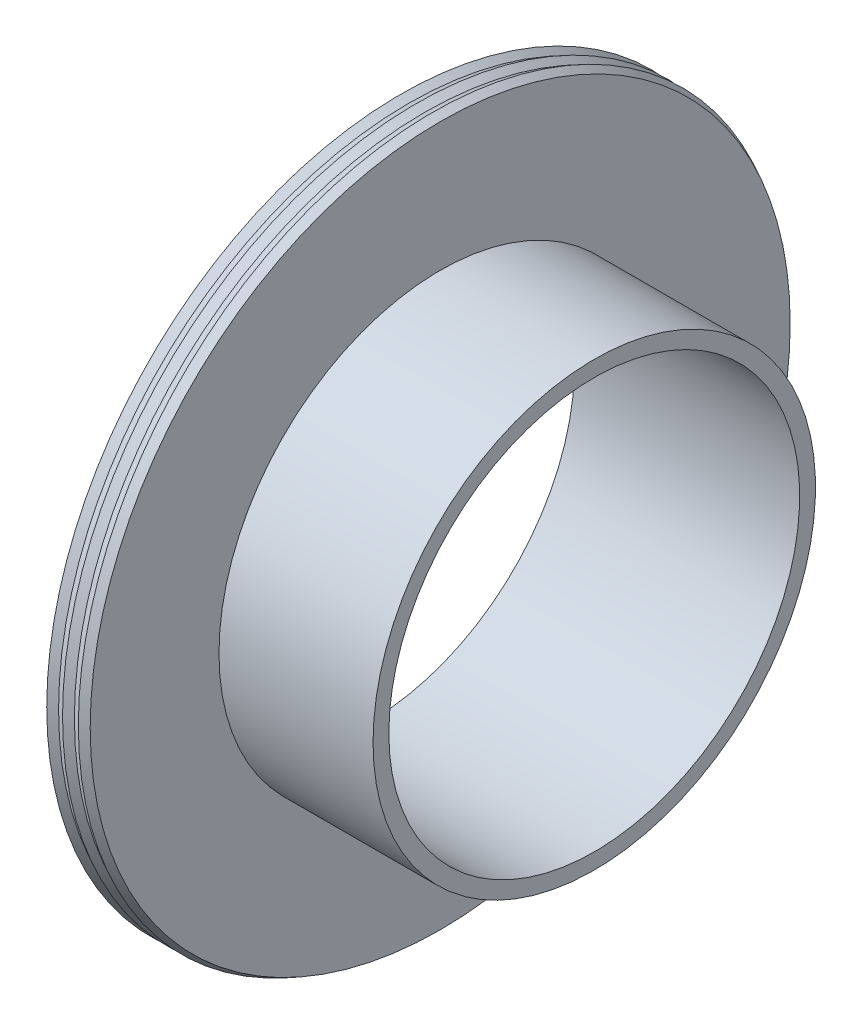
ISO-10303-21;
HEADER;
FILE_DESCRIPTION(('STEP AP214'),'2;1');
FILE_NAME('part.step','',(''),(''),'','','');
FILE_SCHEMA(('AUTOMOTIVE_DESIGN { 1 0 10303 214 1 1 1 1 }'));
ENDSEC;
DATA;
#1=APPLICATION_CONTEXT('core data for automotive mechanical design processes');
#2=APPLICATION_PROTOCOL_DEFINITION('international standard','automotive_design',2000,#1);
#3=PRODUCT_CONTEXT('',#1,'mechanical');
#4=PRODUCT('Part','Part','',(#3));
#5=PRODUCT_RELATED_PRODUCT_CATEGORY('part','',(#4));
#6=PRODUCT_DEFINITION_FORMATION('','',#4);
#7=PRODUCT_DEFINITION_CONTEXT('part definition',#1,'design');
#8=PRODUCT_DEFINITION('design','',#6,#7);
#9=PRODUCT_DEFINITION_SHAPE('','',#8);
#10=(LENGTH_UNIT() NAMED_UNIT(*) SI_UNIT(.MILLI.,.METRE.));
#11=(NAMED_UNIT(*) PLANE_ANGLE_UNIT() SI_UNIT($,.RADIAN.));
#12=(NAMED_UNIT(*) SI_UNIT($,.STERADIAN.) SOLID_ANGLE_UNIT());
#13=UNCERTAINTY_MEASURE_WITH_UNIT(LENGTH_MEASURE(1.E-05),#10,'distance_accuracy_value','');
#14=(GEOMETRIC_REPRESENTATION_CONTEXT(3) GLOBAL_UNCERTAINTY_ASSIGNED_CONTEXT((#13)) GLOBAL_UNIT_ASSIGNED_CONTEXT((#10,
#11,#12)) REPRESENTATION_CONTEXT('',''));
#15=CARTESIAN_POINT('',(0.,0.,0.));
#16=DIRECTION('',(0.,0.,1.));
#17=DIRECTION('',(1.,0.,0.));
#18=AXIS2_PLACEMENT_3D('',#15,#16,#17);
#19=CARTESIAN_POINT('',(6.00000000000003,0.,0.));
#20=DIRECTION('',(-1.,0.,0.));
#21=DIRECTION('',(0.,0.,1.));
#22=AXIS2_PLACEMENT_3D('',#19,#20,#21);
#23=CONICAL_SURFACE('',#22,44.8,0.463647609000823);
#24=CARTESIAN_POINT('',(7.,0.,0.));
#25=DIRECTION('',(-1.,0.,0.));
#26=DIRECTION('',(0.,0.,1.));
#27=AXIS2_PLACEMENT_3D('',#24,#25,#26);
#28=CIRCLE('',#27,44.3);
#29=CARTESIAN_POINT('',(7.,0.,44.3));
#30=VERTEX_POINT('',#29);
#31=EDGE_CURVE('E47',#30,#30,#28,.T.);
#32=ORIENTED_EDGE('',*,*,#31,.T.);
#33=EDGE_LOOP('',(#32));
#34=FACE_BOUND('',#33,.T.);
#35=CARTESIAN_POINT('',(6.00000000000003,0.,0.));
#36=DIRECTION('',(-1.,0.,0.));
#37=DIRECTION('',(0.,0.,1.));
#38=AXIS2_PLACEMENT_3D('',#35,#36,#37);
#39=CIRCLE('',#38,44.8);
#40=CARTESIAN_POINT('',(6.00000000000003,0.,44.8));
#41=VERTEX_POINT('',#40);
#42=EDGE_CURVE('E53',#41,#41,#39,.T.);
#43=ORIENTED_EDGE('',*,*,#42,.F.);
#44=EDGE_LOOP('',(#43));
#45=FACE_BOUND('',#44,.T.);
#46=ADVANCED_FACE('F41',(#34,#45),#23,.T.);
#47=CARTESIAN_POINT('',(7.,0.,0.));
#48=DIRECTION('',(1.,0.,0.));
#49=DIRECTION('',(0.,0.,-1.));
#50=AXIS2_PLACEMENT_3D('',#47,#48,#49);
#51=CONICAL_SURFACE('',#50,44.3,0.463647609000806);
#52=CARTESIAN_POINT('',(8.00000000000001,0.,0.));
#53=DIRECTION('',(-1.,0.,0.));
#54=DIRECTION('',(0.,0.,1.));
#55=AXIS2_PLACEMENT_3D('',#52,#53,#54);
#56=CIRCLE('',#55,44.8);
#57=CARTESIAN_POINT('',(8.00000000000001,0.,44.8));
#58=VERTEX_POINT('',#57);
#59=EDGE_CURVE('E10',#58,#58,#56,.T.);
#60=ORIENTED_EDGE('',*,*,#59,.T.);
#61=EDGE_LOOP('',(#60));
#62=FACE_BOUND('',#61,.T.);
#63=ORIENTED_EDGE('',*,*,#31,.F.);
#64=EDGE_LOOP('',(#63));
#65=FACE_BOUND('',#64,.T.);
#66=ADVANCED_FACE('F94',(#62,#65),#51,.T.);
#67=CARTESIAN_POINT('',(8.00000000000001,0.,0.));
#68=DIRECTION('',(-1.,0.,0.));
#69=DIRECTION('',(0.,0.,1.));
#70=AXIS2_PLACEMENT_3D('',#67,#68,#69);
#71=CONICAL_SURFACE('',#70,44.8,0.463647609000828);
#72=CARTESIAN_POINT('',(9.,0.,0.));
#73=DIRECTION('',(-1.,0.,0.));
#74=DIRECTION('',(0.,0.,1.));
#75=AXIS2_PLACEMENT_3D('',#72,#73,#74);
#76=CIRCLE('',#75,44.3);
#77=CARTESIAN_POINT('',(9.,0.,44.3));
#78=VERTEX_POINT('',#77);
#79=EDGE_CURVE('E70',#78,#78,#76,.T.);
#80=ORIENTED_EDGE('',*,*,#79,.T.);
#81=EDGE_LOOP('',(#80));
#82=FACE_BOUND('',#81,.T.);
#83=ORIENTED_EDGE('',*,*,#59,.F.);
#84=EDGE_LOOP('',(#83));
#85=FACE_BOUND('',#84,.T.);
#86=ADVANCED_FACE('F99',(#82,#85),#71,.T.);
#87=CARTESIAN_POINT('',(9.,0.,0.));
#88=DIRECTION('',(1.,0.,0.));
#89=DIRECTION('',(0.,0.,-1.));
#90=AXIS2_PLACEMENT_3D('',#87,#88,#89);
#91=PLANE('',#90);
#92=CARTESIAN_POINT('',(9.,0.,0.));
#93=DIRECTION('',(-1.,0.,0.));
#94=DIRECTION('',(0.,0.,1.));
#95=AXIS2_PLACEMENT_3D('',#92,#93,#94);
#96=CIRCLE('',#95,28.);
#97=CARTESIAN_POINT('',(9.,0.,28.));
#98=VERTEX_POINT('',#97);
#99=EDGE_CURVE('E75',#98,#98,#96,.T.);
#100=ORIENTED_EDGE('',*,*,#99,.T.);
#101=EDGE_LOOP('',(#100));
#102=FACE_BOUND('',#101,.T.);
#103=ORIENTED_EDGE('',*,*,#79,.F.);
#104=EDGE_LOOP('',(#103));
#105=FACE_BOUND('',#104,.T.);
#106=ADVANCED_FACE('F110',(#102,#105),#91,.T.);
#107=CARTESIAN_POINT('',(5.,0.,0.));
#108=DIRECTION('',(1.,0.,0.));
#109=DIRECTION('',(0.,0.,-1.));
#110=AXIS2_PLACEMENT_3D('',#107,#108,#109);
#111=CONICAL_SURFACE('',#110,44.3,0.4636476090008);
#112=ORIENTED_EDGE('',*,*,#42,.T.);
#113=EDGE_LOOP('',(#112));
#114=FACE_BOUND('',#113,.T.);
#115=CARTESIAN_POINT('',(5.,0.,0.));
#116=DIRECTION('',(-1.,0.,0.));
#117=DIRECTION('',(0.,0.,1.));
#118=AXIS2_PLACEMENT_3D('',#115,#116,#117);
#119=CIRCLE('',#118,44.3);
#120=CARTESIAN_POINT('',(5.,0.,44.3));
#121=VERTEX_POINT('',#120);
#122=EDGE_CURVE('E82',#121,#121,#119,.T.);
#123=ORIENTED_EDGE('',*,*,#122,.F.);
#124=EDGE_LOOP('',(#123));
#125=FACE_BOUND('',#124,.T.);
#126=ADVANCED_FACE('F89',(#114,#125),#111,.T.);
#127=CARTESIAN_POINT('',(4.,0.,0.));
#128=DIRECTION('',(-1.,0.,0.));
#129=DIRECTION('',(0.,0.,1.));
#130=AXIS2_PLACEMENT_3D('',#127,#128,#129);
#131=CONICAL_SURFACE('',#130,44.8,0.463647609000806);
#132=ORIENTED_EDGE('',*,*,#122,.T.);
#133=EDGE_LOOP('',(#132));
#134=FACE_BOUND('',#133,.T.);
#135=CARTESIAN_POINT('',(4.,0.,0.));
#136=DIRECTION('',(-1.,0.,0.));
#137=DIRECTION('',(0.,0.,1.));
#138=AXIS2_PLACEMENT_3D('',#135,#136,#137);
#139=CIRCLE('',#138,44.8);
#140=CARTESIAN_POINT('',(4.,0.,44.8));
#141=VERTEX_POINT('',#140);
#142=EDGE_CURVE('E81',#141,#141,#139,.T.);
#143=ORIENTED_EDGE('',*,*,#142,.F.);
#144=EDGE_LOOP('',(#143));
#145=FACE_BOUND('',#144,.T.);
#146=ADVANCED_FACE('F125',(#134,#145),#131,.T.);
#147=CARTESIAN_POINT('',(4.,0.,0.));
#148=DIRECTION('',(-1.,0.,0.));
#149=DIRECTION('',(0.,0.,1.));
#150=AXIS2_PLACEMENT_3D('',#147,#148,#149);
#151=PLANE('',#150);
#152=ORIENTED_EDGE('',*,*,#142,.T.);
#153=EDGE_LOOP('',(#152));
#154=FACE_BOUND('',#153,.T.);
#155=CARTESIAN_POINT('',(4.00000000000001,0.,0.));
#156=DIRECTION('',(-1.,0.,0.));
#157=DIRECTION('',(0.,0.,1.));
#158=AXIS2_PLACEMENT_3D('',#155,#156,#157);
#159=CIRCLE('',#158,28.);
#160=CARTESIAN_POINT('',(4.00000000000001,0.,28.));
#161=VERTEX_POINT('',#160);
#162=EDGE_CURVE('E77',#161,#161,#159,.T.);
#163=ORIENTED_EDGE('',*,*,#162,.F.);
#164=EDGE_LOOP('',(#163));
#165=FACE_BOUND('',#164,.T.);
#166=ADVANCED_FACE('F119',(#154,#165),#151,.T.);
#167=CARTESIAN_POINT('',(-59.6592581066923,0.,0.));
#168=DIRECTION('',(-1.,0.,0.));
#169=DIRECTION('',(0.,0.,1.));
#170=AXIS2_PLACEMENT_3D('',#167,#168,#169);
#171=CYLINDRICAL_SURFACE('',#170,26.);
#172=CARTESIAN_POINT('',(28.5,0.,0.));
#173=DIRECTION('',(-1.,0.,0.));
#174=DIRECTION('',(0.,0.,1.));
#175=AXIS2_PLACEMENT_3D('',#172,#173,#174);
#176=CIRCLE('',#175,26.);
#177=CARTESIAN_POINT('',(28.5,0.,26.));
#178=VERTEX_POINT('',#177);
#179=EDGE_CURVE('E64',#178,#178,#176,.T.);
#180=ORIENTED_EDGE('',*,*,#179,.F.);
#181=EDGE_LOOP('',(#180));
#182=FACE_BOUND('',#181,.T.);
#183=CARTESIAN_POINT('',(0.,0.,0.));
#184=DIRECTION('',(-1.,0.,0.));
#185=DIRECTION('',(0.,0.,1.));
#186=AXIS2_PLACEMENT_3D('',#183,#184,#185);
#187=CIRCLE('',#186,26.);
#188=CARTESIAN_POINT('',(0.,0.,26.));
#189=VERTEX_POINT('',#188);
#190=EDGE_CURVE('E44',#189,#189,#187,.T.);
#191=ORIENTED_EDGE('',*,*,#190,.T.);
#192=EDGE_LOOP('',(#191));
#193=FACE_BOUND('',#192,.T.);
#194=ADVANCED_FACE('F113',(#182,#193),#171,.F.);
#195=CARTESIAN_POINT('',(28.5,26.,0.));
#196=DIRECTION('',(-1.,0.,0.));
#197=DIRECTION('',(0.,0.,1.));
#198=AXIS2_PLACEMENT_3D('',#195,#196,#197);
#199=PLANE('',#198);
#200=CARTESIAN_POINT('',(28.5,0.,0.));
#201=DIRECTION('',(-1.,0.,0.));
#202=DIRECTION('',(0.,0.,1.));
#203=AXIS2_PLACEMENT_3D('',#200,#201,#202);
#204=CIRCLE('',#203,28.);
#205=CARTESIAN_POINT('',(28.5,0.,28.));
#206=VERTEX_POINT('',#205);
#207=EDGE_CURVE('E61',#206,#206,#204,.T.);
#208=ORIENTED_EDGE('',*,*,#207,.F.);
#209=EDGE_LOOP('',(#208));
#210=FACE_BOUND('',#209,.T.);
#211=ORIENTED_EDGE('',*,*,#179,.T.);
#212=EDGE_LOOP('',(#211));
#213=FACE_BOUND('',#212,.T.);
#214=ADVANCED_FACE('F112',(#210,#213),#199,.F.);
#215=CARTESIAN_POINT('',(-59.6592581066923,0.,0.));
#216=DIRECTION('',(-1.,0.,0.));
#217=DIRECTION('',(0.,0.,1.));
#218=AXIS2_PLACEMENT_3D('',#215,#216,#217);
#219=CYLINDRICAL_SURFACE('',#218,28.);
#220=ORIENTED_EDGE('',*,*,#99,.F.);
#221=EDGE_LOOP('',(#220));
#222=FACE_BOUND('',#221,.T.);
#223=ORIENTED_EDGE('',*,*,#207,.T.);
#224=EDGE_LOOP('',(#223));
#225=FACE_BOUND('',#224,.T.);
#226=ADVANCED_FACE('F107',(#222,#225),#219,.T.);
#227=CARTESIAN_POINT('',(0.,28.,0.));
#228=DIRECTION('',(1.,0.,0.));
#229=DIRECTION('',(0.,0.,-1.));
#230=AXIS2_PLACEMENT_3D('',#227,#228,#229);
#231=PLANE('',#230);
#232=ORIENTED_EDGE('',*,*,#190,.F.);
#233=EDGE_LOOP('',(#232));
#234=FACE_BOUND('',#233,.T.);
#235=CARTESIAN_POINT('',(0.,0.,0.));
#236=DIRECTION('',(-1.,0.,0.));
#237=DIRECTION('',(0.,0.,1.));
#238=AXIS2_PLACEMENT_3D('',#235,#236,#237);
#239=CIRCLE('',#238,28.);
#240=CARTESIAN_POINT('',(0.,0.,28.));
#241=VERTEX_POINT('',#240);
#242=EDGE_CURVE('E59',#241,#241,#239,.T.);
#243=ORIENTED_EDGE('',*,*,#242,.T.);
#244=EDGE_LOOP('',(#243));
#245=FACE_BOUND('',#244,.T.);
#246=ADVANCED_FACE('F43',(#234,#245),#231,.F.);
#247=ORIENTED_EDGE('',*,*,#162,.T.);
#248=EDGE_LOOP('',(#247));
#249=FACE_BOUND('',#248,.T.);
#250=ORIENTED_EDGE('',*,*,#242,.F.);
#251=EDGE_LOOP('',(#250));
#252=FACE_BOUND('',#251,.T.);
#253=ADVANCED_FACE('F114',(#249,#252),#219,.T.);
#254=CLOSED_SHELL('',(#46,#66,#86,#106,#126,#146,#166,#194,#214,#226,#246,#253));
#255=MANIFOLD_SOLID_BREP('B2',#254);
#256=ADVANCED_BREP_SHAPE_REPRESENTATION('',(#18,#255),#14);
#257=SHAPE_DEFINITION_REPRESENTATION(#9,#256);
ENDSEC;
END-ISO-10303-21;
